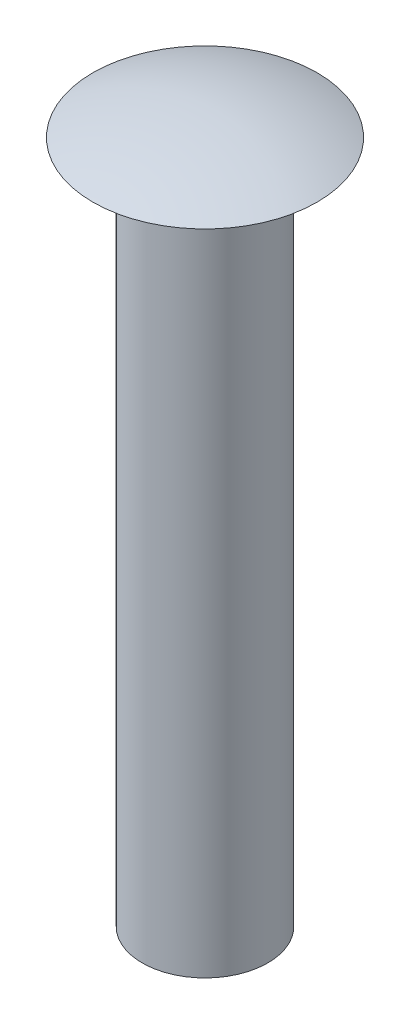
ISO-10303-21;
HEADER;
FILE_DESCRIPTION(('STEP AP214'),'2;1');
FILE_NAME('part.step','',(''),(''),'','','');
FILE_SCHEMA(('AUTOMOTIVE_DESIGN { 1 0 10303 214 1 1 1 1 }'));
ENDSEC;
DATA;
#1=APPLICATION_CONTEXT('core data for automotive mechanical design processes');
#2=APPLICATION_PROTOCOL_DEFINITION('international standard','automotive_design',2000,#1);
#3=PRODUCT_CONTEXT('',#1,'mechanical');
#4=PRODUCT('Part','Part','',(#3));
#5=PRODUCT_RELATED_PRODUCT_CATEGORY('part','',(#4));
#6=PRODUCT_DEFINITION_FORMATION('','',#4);
#7=PRODUCT_DEFINITION_CONTEXT('part definition',#1,'design');
#8=PRODUCT_DEFINITION('design','',#6,#7);
#9=PRODUCT_DEFINITION_SHAPE('','',#8);
#10=(LENGTH_UNIT() NAMED_UNIT(*) SI_UNIT(.MILLI.,.METRE.));
#11=(NAMED_UNIT(*) PLANE_ANGLE_UNIT() SI_UNIT($,.RADIAN.));
#12=(NAMED_UNIT(*) SI_UNIT($,.STERADIAN.) SOLID_ANGLE_UNIT());
#13=UNCERTAINTY_MEASURE_WITH_UNIT(LENGTH_MEASURE(1.E-05),#10,'distance_accuracy_value','');
#14=(GEOMETRIC_REPRESENTATION_CONTEXT(3) GLOBAL_UNCERTAINTY_ASSIGNED_CONTEXT((#13)) GLOBAL_UNIT_ASSIGNED_CONTEXT((#10,
#11,#12)) REPRESENTATION_CONTEXT('',''));
#15=CARTESIAN_POINT('',(0.,0.,0.));
#16=DIRECTION('',(0.,0.,1.));
#17=DIRECTION('',(1.,0.,0.));
#18=AXIS2_PLACEMENT_3D('',#15,#16,#17);
#19=CARTESIAN_POINT('',(0.,19.05,0.));
#20=DIRECTION('',(0.,-1.,0.));
#21=DIRECTION('',(0.,0.,-1.));
#22=AXIS2_PLACEMENT_3D('',#19,#20,#21);
#23=CYLINDRICAL_SURFACE('',#22,1.75);
#24=CARTESIAN_POINT('',(0.,19.05,0.));
#25=DIRECTION('',(0.,1.,0.));
#26=DIRECTION('',(0.,0.,1.));
#27=AXIS2_PLACEMENT_3D('',#24,#25,#26);
#28=CIRCLE('',#27,1.75);
#29=CARTESIAN_POINT('',(0.,19.05,-1.75));
#30=VERTEX_POINT('',#29);
#31=EDGE_CURVE('E11',#30,#30,#28,.T.);
#32=CARTESIAN_POINT('',(0.,0.,0.));
#33=DIRECTION('',(0.,1.,0.));
#34=DIRECTION('',(0.,0.,1.));
#35=AXIS2_PLACEMENT_3D('',#32,#33,#34);
#36=CIRCLE('',#35,1.75);
#37=CARTESIAN_POINT('',(0.,0.,-1.75));
#38=VERTEX_POINT('',#37);
#39=EDGE_CURVE('E44',#38,#38,#36,.T.);
#40=CARTESIAN_POINT('',(0.,19.05,-1.75));
#41=CARTESIAN_POINT('',(0.,18.8515625,-1.75));
#42=CARTESIAN_POINT('',(0.,18.653125,-1.75));
#43=CARTESIAN_POINT('',(0.,18.25625,-1.75));
#44=CARTESIAN_POINT('',(0.,18.0578125,-1.75));
#45=CARTESIAN_POINT('',(0.,17.6609375,-1.75));
#46=CARTESIAN_POINT('',(0.,17.4625,-1.75));
#47=CARTESIAN_POINT('',(0.,17.065625,-1.75));
#48=CARTESIAN_POINT('',(0.,16.8671875,-1.75));
#49=CARTESIAN_POINT('',(0.,16.4703125,-1.75));
#50=CARTESIAN_POINT('',(0.,16.271875,-1.75));
#51=CARTESIAN_POINT('',(0.,15.875,-1.75));
#52=CARTESIAN_POINT('',(0.,15.6765625,-1.75));
#53=CARTESIAN_POINT('',(0.,15.2796875,-1.75));
#54=CARTESIAN_POINT('',(0.,15.08125,-1.75));
#55=CARTESIAN_POINT('',(0.,14.684375,-1.75));
#56=CARTESIAN_POINT('',(0.,14.4859375,-1.75));
#57=CARTESIAN_POINT('',(0.,14.0890625,-1.75));
#58=CARTESIAN_POINT('',(0.,13.890625,-1.75));
#59=CARTESIAN_POINT('',(0.,13.49375,-1.75));
#60=CARTESIAN_POINT('',(0.,13.2953125,-1.75));
#61=CARTESIAN_POINT('',(0.,12.8984375,-1.75));
#62=CARTESIAN_POINT('',(0.,12.7,-1.75));
#63=CARTESIAN_POINT('',(0.,12.303125,-1.75));
#64=CARTESIAN_POINT('',(0.,12.1046875,-1.75));
#65=CARTESIAN_POINT('',(0.,11.7078125,-1.75));
#66=CARTESIAN_POINT('',(0.,11.509375,-1.75));
#67=CARTESIAN_POINT('',(0.,11.1125,-1.75));
#68=CARTESIAN_POINT('',(0.,10.9140625,-1.75));
#69=CARTESIAN_POINT('',(0.,10.5171875,-1.75));
#70=CARTESIAN_POINT('',(0.,10.31875,-1.75));
#71=CARTESIAN_POINT('',(0.,9.921875,-1.75));
#72=CARTESIAN_POINT('',(0.,9.7234375,-1.75));
#73=CARTESIAN_POINT('',(0.,9.3265625,-1.75));
#74=CARTESIAN_POINT('',(0.,9.128125,-1.75));
#75=CARTESIAN_POINT('',(0.,8.73125,-1.75));
#76=CARTESIAN_POINT('',(0.,8.5328125,-1.75));
#77=CARTESIAN_POINT('',(0.,8.1359375,-1.75));
#78=CARTESIAN_POINT('',(0.,7.9375,-1.75));
#79=CARTESIAN_POINT('',(0.,7.540625,-1.75));
#80=CARTESIAN_POINT('',(0.,7.3421875,-1.75));
#81=CARTESIAN_POINT('',(0.,6.9453125,-1.75));
#82=CARTESIAN_POINT('',(0.,6.746875,-1.75));
#83=CARTESIAN_POINT('',(0.,6.35,-1.75));
#84=CARTESIAN_POINT('',(0.,6.1515625,-1.75));
#85=CARTESIAN_POINT('',(0.,5.7546875,-1.75));
#86=CARTESIAN_POINT('',(0.,5.55625,-1.75));
#87=CARTESIAN_POINT('',(0.,5.159375,-1.75));
#88=CARTESIAN_POINT('',(0.,4.9609375,-1.75));
#89=CARTESIAN_POINT('',(0.,4.5640625,-1.75));
#90=CARTESIAN_POINT('',(0.,4.365625,-1.75));
#91=CARTESIAN_POINT('',(0.,3.96875,-1.75));
#92=CARTESIAN_POINT('',(0.,3.7703125,-1.75));
#93=CARTESIAN_POINT('',(0.,3.3734375,-1.75));
#94=CARTESIAN_POINT('',(0.,3.175,-1.75));
#95=CARTESIAN_POINT('',(0.,2.778125,-1.75));
#96=CARTESIAN_POINT('',(0.,2.5796875,-1.75));
#97=CARTESIAN_POINT('',(0.,2.1828125,-1.75));
#98=CARTESIAN_POINT('',(0.,1.984375,-1.75));
#99=CARTESIAN_POINT('',(0.,1.5875,-1.75));
#100=CARTESIAN_POINT('',(0.,1.3890625,-1.75));
#101=CARTESIAN_POINT('',(0.,0.992187500000001,-1.75));
#102=CARTESIAN_POINT('',(0.,0.793750000000001,-1.75));
#103=CARTESIAN_POINT('',(0.,0.396875,-1.75));
#104=CARTESIAN_POINT('',(0.,0.1984375,-1.75));
#105=CARTESIAN_POINT('',(0.,0.,-1.75));
#106=B_SPLINE_CURVE_WITH_KNOTS('',3,(#40,#41,#42,#43,#44,#45,#46,#47,#48,#49,#50,#51,#52,#53,
#54,#55,#56,#57,#58,#59,#60,#61,#62,#63,#64,#65,#66,#67,#68,#69,#70,#71,#72,#73,#74,#75,#76,#77,
#78,#79,#80,#81,#82,#83,#84,#85,#86,#87,#88,#89,#90,#91,#92,#93,#94,#95,#96,#97,#98,#99,#100,
#101,#102,#103,#104,#105),.UNSPECIFIED.,.F.,.F.,(4,2,2,2,2,2,2,2,2,2,2,2,2,2,2,2,2,2,2,2,2,2,2,
2,2,2,2,2,2,2,2,2,4),(0.,0.595312499999997,1.190625,1.7859375,2.38125,2.9765625,3.571875,
4.1671875,4.7625,5.3578125,5.953125,6.5484375,7.14375,7.7390625,8.334375,8.9296875,9.525,
10.1203125,10.715625,11.3109375,11.90625,12.5015625,13.096875,13.6921875,14.2875,14.8828125,
15.478125,16.0734375,16.66875,17.2640625,17.859375,18.4546875,19.05),.UNSPECIFIED.);
#107=EDGE_CURVE('BSEAM41',#30,#38,#106,.T.);
#108=ORIENTED_EDGE('',*,*,#31,.F.);
#109=ORIENTED_EDGE('',*,*,#39,.T.);
#110=ORIENTED_EDGE('',*,*,#107,.T.);
#111=ORIENTED_EDGE('',*,*,#107,.F.);
#112=EDGE_LOOP('',(#108,#110,#109,#111));
#113=FACE_BOUND('',#112,.T.);
#114=ADVANCED_FACE('F41',(#113),#23,.T.);
#115=CARTESIAN_POINT('',(0.,0.,0.));
#116=DIRECTION('',(0.,1.,0.));
#117=DIRECTION('',(0.,0.,1.));
#118=AXIS2_PLACEMENT_3D('',#115,#116,#117);
#119=PLANE('',#118);
#120=ORIENTED_EDGE('',*,*,#39,.F.);
#121=EDGE_LOOP('',(#120));
#122=FACE_BOUND('',#121,.T.);
#123=ADVANCED_FACE('F67',(#122),#119,.F.);
#124=CARTESIAN_POINT('',(0.,19.05,0.));
#125=DIRECTION('',(0.,-1.,0.));
#126=DIRECTION('',(0.,0.,-1.));
#127=AXIS2_PLACEMENT_3D('',#124,#125,#126);
#128=PLANE('',#127);
#129=ORIENTED_EDGE('',*,*,#31,.T.);
#130=EDGE_LOOP('',(#129));
#131=FACE_BOUND('',#130,.T.);
#132=CARTESIAN_POINT('',(0.,19.05,0.));
#133=DIRECTION('',(0.,-1.,0.));
#134=DIRECTION('',(0.,0.,-1.));
#135=AXIS2_PLACEMENT_3D('',#132,#133,#134);
#136=CIRCLE('',#135,3.125);
#137=CARTESIAN_POINT('',(0.,19.05,-3.125));
#138=VERTEX_POINT('',#137);
#139=EDGE_CURVE('E58',#138,#138,#136,.T.);
#140=ORIENTED_EDGE('',*,*,#139,.T.);
#141=EDGE_LOOP('',(#140));
#142=FACE_BOUND('',#141,.T.);
#143=ADVANCED_FACE('F54',(#131,#142),#128,.T.);
#144=CARTESIAN_POINT('',(0.,11.6755446596133,0.000505325166577945));
#145=DIRECTION('',(-1.,0.,0.));
#146=DIRECTION('',(0.,0.,-1.));
#147=AXIS2_PLACEMENT_3D('',#144,#145,#146);
#148=CIRCLE('',#147,8.00945535632746);
#149=TRIMMED_CURVE('',#148,(PARAMETER_VALUE(-1.57073323571761)),
(PARAMETER_VALUE(1.57073323571761)),.T.,.PARAMETER.);
#150=CARTESIAN_POINT('',(0.,11.6755446596133,0.));
#151=DIRECTION('',(0.,-1.,0.));
#152=AXIS1_PLACEMENT('',#150,#151);
#153=SURFACE_OF_REVOLUTION('',#149,#152);
#154=CARTESIAN_POINT('',(0.,19.685,0.));
#155=VERTEX_POINT('',#154);
#156=VERTEX_LOOP('',#155);
#157=FACE_BOUND('',#156,.T.);
#158=ORIENTED_EDGE('',*,*,#139,.F.);
#159=EDGE_LOOP('',(#158));
#160=FACE_BOUND('',#159,.T.);
#161=ADVANCED_FACE('F51',(#157,#160),#153,.T.);
#162=CLOSED_SHELL('',(#114,#123,#143,#161));
#163=MANIFOLD_SOLID_BREP('B2',#162);
#164=ADVANCED_BREP_SHAPE_REPRESENTATION('',(#18,#163),#14);
#165=SHAPE_DEFINITION_REPRESENTATION(#9,#164);
ENDSEC;
END-ISO-10303-21;
